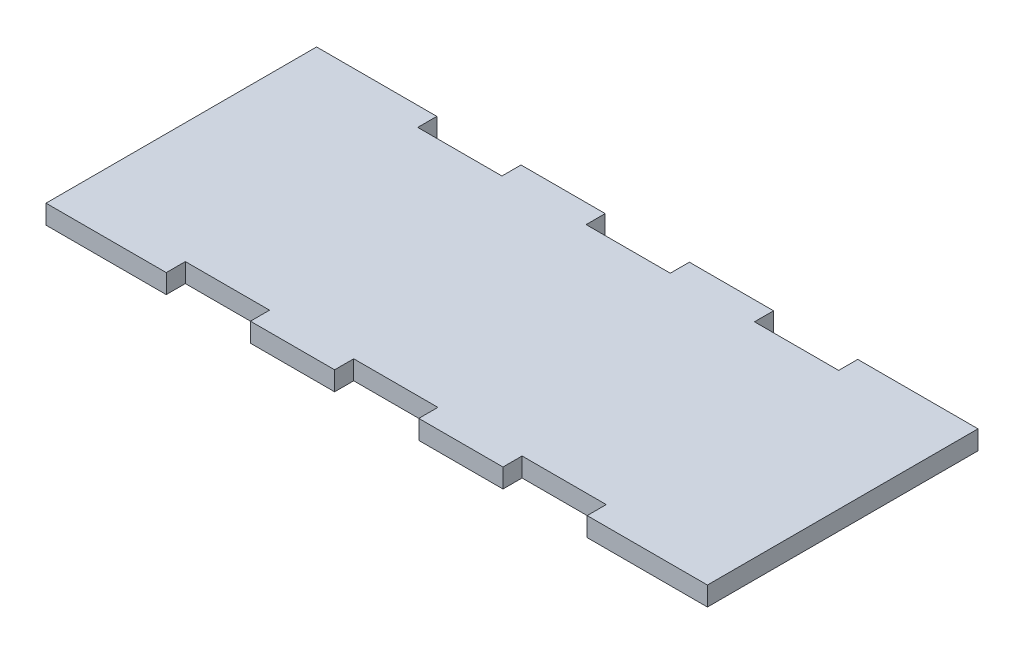
ISO-10303-21;
HEADER;
FILE_DESCRIPTION(('STEP AP214'),'2;1');
FILE_NAME('part.step','',(''),(''),'','','');
FILE_SCHEMA(('AUTOMOTIVE_DESIGN { 1 0 10303 214 1 1 1 1 }'));
ENDSEC;
DATA;
#1=APPLICATION_CONTEXT('core data for automotive mechanical design processes');
#2=APPLICATION_PROTOCOL_DEFINITION('international standard','automotive_design',2000,#1);
#3=PRODUCT_CONTEXT('',#1,'mechanical');
#4=PRODUCT('Part','Part','',(#3));
#5=PRODUCT_RELATED_PRODUCT_CATEGORY('part','',(#4));
#6=PRODUCT_DEFINITION_FORMATION('','',#4);
#7=PRODUCT_DEFINITION_CONTEXT('part definition',#1,'design');
#8=PRODUCT_DEFINITION('design','',#6,#7);
#9=PRODUCT_DEFINITION_SHAPE('','',#8);
#10=(LENGTH_UNIT() NAMED_UNIT(*) SI_UNIT(.MILLI.,.METRE.));
#11=(NAMED_UNIT(*) PLANE_ANGLE_UNIT() SI_UNIT($,.RADIAN.));
#12=(NAMED_UNIT(*) SI_UNIT($,.STERADIAN.) SOLID_ANGLE_UNIT());
#13=UNCERTAINTY_MEASURE_WITH_UNIT(LENGTH_MEASURE(1.E-05),#10,'distance_accuracy_value','');
#14=(GEOMETRIC_REPRESENTATION_CONTEXT(3) GLOBAL_UNCERTAINTY_ASSIGNED_CONTEXT((#13)) GLOBAL_UNIT_ASSIGNED_CONTEXT((#10,
#11,#12)) REPRESENTATION_CONTEXT('',''));
#15=CARTESIAN_POINT('',(0.,0.,0.));
#16=DIRECTION('',(0.,0.,1.));
#17=DIRECTION('',(1.,0.,0.));
#18=AXIS2_PLACEMENT_3D('',#15,#16,#17);
#19=CARTESIAN_POINT('',(62.,3.175,0.));
#20=DIRECTION('',(1.,0.,0.));
#21=DIRECTION('',(0.,0.,-1.));
#22=AXIS2_PLACEMENT_3D('',#19,#20,#21);
#23=PLANE('',#22);
#24=DIRECTION('',(0.,0.,1.));
#25=VECTOR('',#24,1.);
#26=CARTESIAN_POINT('',(62.,0.,0.));
#27=LINE('',#26,#25);
#28=CARTESIAN_POINT('',(62.,0.,-3.175));
#29=VERTEX_POINT('',#28);
#30=CARTESIAN_POINT('',(62.,0.,0.));
#31=VERTEX_POINT('',#30);
#32=EDGE_CURVE('E251',#29,#31,#27,.T.);
#33=ORIENTED_EDGE('',*,*,#32,.T.);
#34=DIRECTION('',(0.,-1.,0.));
#35=VECTOR('',#34,1.);
#36=CARTESIAN_POINT('',(62.,3.175,0.));
#37=LINE('',#36,#35);
#38=CARTESIAN_POINT('',(62.,3.175,0.));
#39=VERTEX_POINT('',#38);
#40=EDGE_CURVE('E11',#39,#31,#37,.T.);
#41=ORIENTED_EDGE('',*,*,#40,.F.);
#42=DIRECTION('',(0.,0.,1.));
#43=VECTOR('',#42,1.);
#44=CARTESIAN_POINT('',(62.,3.175,0.));
#45=LINE('',#44,#43);
#46=CARTESIAN_POINT('',(62.,3.175,-3.175));
#47=VERTEX_POINT('',#46);
#48=EDGE_CURVE('E320',#47,#39,#45,.T.);
#49=ORIENTED_EDGE('',*,*,#48,.F.);
#50=DIRECTION('',(0.,-1.,0.));
#51=VECTOR('',#50,1.);
#52=CARTESIAN_POINT('',(62.,3.175,-3.175));
#53=LINE('',#52,#51);
#54=EDGE_CURVE('E247',#47,#29,#53,.T.);
#55=ORIENTED_EDGE('',*,*,#54,.T.);
#56=EDGE_LOOP('',(#33,#41,#49,#55));
#57=FACE_BOUND('',#56,.T.);
#58=ADVANCED_FACE('F35',(#57),#23,.F.);
#59=CARTESIAN_POINT('',(0.,3.175,0.));
#60=DIRECTION('',(0.,0.,-1.));
#61=DIRECTION('',(-1.,0.,0.));
#62=AXIS2_PLACEMENT_3D('',#59,#60,#61);
#63=PLANE('',#62);
#64=DIRECTION('',(1.,0.,0.));
#65=VECTOR('',#64,1.);
#66=CARTESIAN_POINT('',(0.,0.,0.));
#67=LINE('',#66,#65);
#68=CARTESIAN_POINT('',(76.,0.,0.));
#69=VERTEX_POINT('',#68);
#70=EDGE_CURVE('E254',#31,#69,#67,.T.);
#71=ORIENTED_EDGE('',*,*,#70,.T.);
#72=DIRECTION('',(0.,-1.,0.));
#73=VECTOR('',#72,1.);
#74=CARTESIAN_POINT('',(76.,3.175,0.));
#75=LINE('',#74,#73);
#76=CARTESIAN_POINT('',(76.,3.175,0.));
#77=VERTEX_POINT('',#76);
#78=EDGE_CURVE('E43',#77,#69,#75,.T.);
#79=ORIENTED_EDGE('',*,*,#78,.F.);
#80=DIRECTION('',(1.,0.,0.));
#81=VECTOR('',#80,1.);
#82=CARTESIAN_POINT('',(0.,3.175,0.));
#83=LINE('',#82,#81);
#84=EDGE_CURVE('E154',#39,#77,#83,.T.);
#85=ORIENTED_EDGE('',*,*,#84,.F.);
#86=ORIENTED_EDGE('',*,*,#40,.T.);
#87=EDGE_LOOP('',(#71,#79,#85,#86));
#88=FACE_BOUND('',#87,.T.);
#89=ADVANCED_FACE('F477',(#88),#63,.F.);
#90=CARTESIAN_POINT('',(76.,3.175,0.));
#91=DIRECTION('',(-1.,0.,0.));
#92=DIRECTION('',(0.,0.,1.));
#93=AXIS2_PLACEMENT_3D('',#90,#91,#92);
#94=PLANE('',#93);
#95=DIRECTION('',(0.,0.,-1.));
#96=VECTOR('',#95,1.);
#97=CARTESIAN_POINT('',(76.,0.,0.));
#98=LINE('',#97,#96);
#99=CARTESIAN_POINT('',(76.,0.,-3.175));
#100=VERTEX_POINT('',#99);
#101=EDGE_CURVE('E256',#69,#100,#98,.T.);
#102=ORIENTED_EDGE('',*,*,#101,.T.);
#103=DIRECTION('',(0.,-1.,0.));
#104=VECTOR('',#103,1.);
#105=CARTESIAN_POINT('',(76.,3.175,-3.175));
#106=LINE('',#105,#104);
#107=CARTESIAN_POINT('',(76.,3.175,-3.175));
#108=VERTEX_POINT('',#107);
#109=EDGE_CURVE('E372',#108,#100,#106,.T.);
#110=ORIENTED_EDGE('',*,*,#109,.F.);
#111=DIRECTION('',(0.,0.,-1.));
#112=VECTOR('',#111,1.);
#113=CARTESIAN_POINT('',(76.,3.175,0.));
#114=LINE('',#113,#112);
#115=EDGE_CURVE('E380',#77,#108,#114,.T.);
#116=ORIENTED_EDGE('',*,*,#115,.F.);
#117=ORIENTED_EDGE('',*,*,#78,.T.);
#118=EDGE_LOOP('',(#102,#110,#116,#117));
#119=FACE_BOUND('',#118,.T.);
#120=ADVANCED_FACE('F378',(#119),#94,.F.);
#121=CARTESIAN_POINT('',(0.,3.175,-3.175));
#122=DIRECTION('',(0.,0.,-1.));
#123=DIRECTION('',(-1.,0.,0.));
#124=AXIS2_PLACEMENT_3D('',#121,#122,#123);
#125=PLANE('',#124);
#126=DIRECTION('',(1.,0.,0.));
#127=VECTOR('',#126,1.);
#128=CARTESIAN_POINT('',(0.,0.,-3.175));
#129=LINE('',#128,#127);
#130=CARTESIAN_POINT('',(90.,0.,-3.175));
#131=VERTEX_POINT('',#130);
#132=EDGE_CURVE('E258',#100,#131,#129,.T.);
#133=ORIENTED_EDGE('',*,*,#132,.T.);
#134=DIRECTION('',(0.,-1.,0.));
#135=VECTOR('',#134,1.);
#136=CARTESIAN_POINT('',(90.,3.175,-3.175));
#137=LINE('',#136,#135);
#138=CARTESIAN_POINT('',(90.,3.175,-3.175));
#139=VERTEX_POINT('',#138);
#140=EDGE_CURVE('E369',#139,#131,#137,.T.);
#141=ORIENTED_EDGE('',*,*,#140,.F.);
#142=DIRECTION('',(1.,0.,0.));
#143=VECTOR('',#142,1.);
#144=CARTESIAN_POINT('',(0.,3.175,-3.175));
#145=LINE('',#144,#143);
#146=EDGE_CURVE('E398',#108,#139,#145,.T.);
#147=ORIENTED_EDGE('',*,*,#146,.F.);
#148=ORIENTED_EDGE('',*,*,#109,.T.);
#149=EDGE_LOOP('',(#133,#141,#147,#148));
#150=FACE_BOUND('',#149,.T.);
#151=ADVANCED_FACE('F389',(#150),#125,.F.);
#152=CARTESIAN_POINT('',(90.,3.175,0.));
#153=DIRECTION('',(1.,0.,0.));
#154=DIRECTION('',(0.,0.,-1.));
#155=AXIS2_PLACEMENT_3D('',#152,#153,#154);
#156=PLANE('',#155);
#157=DIRECTION('',(0.,0.,1.));
#158=VECTOR('',#157,1.);
#159=CARTESIAN_POINT('',(90.,0.,0.));
#160=LINE('',#159,#158);
#161=CARTESIAN_POINT('',(90.,0.,0.));
#162=VERTEX_POINT('',#161);
#163=EDGE_CURVE('E260',#131,#162,#160,.T.);
#164=ORIENTED_EDGE('',*,*,#163,.T.);
#165=DIRECTION('',(0.,-1.,0.));
#166=VECTOR('',#165,1.);
#167=CARTESIAN_POINT('',(90.,3.175,0.));
#168=LINE('',#167,#166);
#169=CARTESIAN_POINT('',(90.,3.175,0.));
#170=VERTEX_POINT('',#169);
#171=EDGE_CURVE('E366',#170,#162,#168,.T.);
#172=ORIENTED_EDGE('',*,*,#171,.F.);
#173=DIRECTION('',(0.,0.,1.));
#174=VECTOR('',#173,1.);
#175=CARTESIAN_POINT('',(90.,3.175,0.));
#176=LINE('',#175,#174);
#177=EDGE_CURVE('E395',#139,#170,#176,.T.);
#178=ORIENTED_EDGE('',*,*,#177,.F.);
#179=ORIENTED_EDGE('',*,*,#140,.T.);
#180=EDGE_LOOP('',(#164,#172,#178,#179));
#181=FACE_BOUND('',#180,.T.);
#182=ADVANCED_FACE('F393',(#181),#156,.F.);
#183=CARTESIAN_POINT('',(0.,3.175,0.));
#184=DIRECTION('',(0.,0.,-1.));
#185=DIRECTION('',(-1.,0.,0.));
#186=AXIS2_PLACEMENT_3D('',#183,#184,#185);
#187=PLANE('',#186);
#188=DIRECTION('',(1.,0.,0.));
#189=VECTOR('',#188,1.);
#190=CARTESIAN_POINT('',(0.,0.,0.));
#191=LINE('',#190,#189);
#192=CARTESIAN_POINT('',(110.,0.,0.));
#193=VERTEX_POINT('',#192);
#194=EDGE_CURVE('E262',#162,#193,#191,.T.);
#195=ORIENTED_EDGE('',*,*,#194,.T.);
#196=DIRECTION('',(0.,-1.,0.));
#197=VECTOR('',#196,1.);
#198=CARTESIAN_POINT('',(110.,3.175,0.));
#199=LINE('',#198,#197);
#200=CARTESIAN_POINT('',(110.,3.175,0.));
#201=VERTEX_POINT('',#200);
#202=EDGE_CURVE('E363',#201,#193,#199,.T.);
#203=ORIENTED_EDGE('',*,*,#202,.F.);
#204=DIRECTION('',(1.,0.,0.));
#205=VECTOR('',#204,1.);
#206=CARTESIAN_POINT('',(0.,3.175,0.));
#207=LINE('',#206,#205);
#208=EDGE_CURVE('E397',#170,#201,#207,.T.);
#209=ORIENTED_EDGE('',*,*,#208,.F.);
#210=ORIENTED_EDGE('',*,*,#171,.T.);
#211=EDGE_LOOP('',(#195,#203,#209,#210));
#212=FACE_BOUND('',#211,.T.);
#213=ADVANCED_FACE('F490',(#212),#187,.F.);
#214=CARTESIAN_POINT('',(110.,3.175,0.));
#215=DIRECTION('',(-1.,0.,0.));
#216=DIRECTION('',(0.,0.,1.));
#217=AXIS2_PLACEMENT_3D('',#214,#215,#216);
#218=PLANE('',#217);
#219=DIRECTION('',(0.,0.,-1.));
#220=VECTOR('',#219,1.);
#221=CARTESIAN_POINT('',(110.,0.,0.));
#222=LINE('',#221,#220);
#223=CARTESIAN_POINT('',(110.,0.,-45.));
#224=VERTEX_POINT('',#223);
#225=EDGE_CURVE('E264',#193,#224,#222,.T.);
#226=ORIENTED_EDGE('',*,*,#225,.T.);
#227=DIRECTION('',(0.,-1.,0.));
#228=VECTOR('',#227,1.);
#229=CARTESIAN_POINT('',(110.,3.175,-45.));
#230=LINE('',#229,#228);
#231=CARTESIAN_POINT('',(110.,3.175,-45.));
#232=VERTEX_POINT('',#231);
#233=EDGE_CURVE('E361',#232,#224,#230,.T.);
#234=ORIENTED_EDGE('',*,*,#233,.F.);
#235=DIRECTION('',(0.,0.,-1.));
#236=VECTOR('',#235,1.);
#237=CARTESIAN_POINT('',(110.,3.175,0.));
#238=LINE('',#237,#236);
#239=EDGE_CURVE('E400',#201,#232,#238,.T.);
#240=ORIENTED_EDGE('',*,*,#239,.F.);
#241=ORIENTED_EDGE('',*,*,#202,.T.);
#242=EDGE_LOOP('',(#226,#234,#240,#241));
#243=FACE_BOUND('',#242,.T.);
#244=ADVANCED_FACE('F493',(#243),#218,.F.);
#245=CARTESIAN_POINT('',(0.,3.175,-45.));
#246=DIRECTION('',(0.,0.,-1.));
#247=DIRECTION('',(-1.,0.,0.));
#248=AXIS2_PLACEMENT_3D('',#245,#246,#247);
#249=PLANE('',#248);
#250=DIRECTION('',(1.,0.,0.));
#251=VECTOR('',#250,1.);
#252=CARTESIAN_POINT('',(0.,0.,-45.));
#253=LINE('',#252,#251);
#254=CARTESIAN_POINT('',(90.,0.,-45.));
#255=VERTEX_POINT('',#254);
#256=EDGE_CURVE('E267',#255,#224,#253,.T.);
#257=ORIENTED_EDGE('',*,*,#256,.F.);
#258=DIRECTION('',(0.,-1.,0.));
#259=VECTOR('',#258,1.);
#260=CARTESIAN_POINT('',(90.,3.175,-45.));
#261=LINE('',#260,#259);
#262=CARTESIAN_POINT('',(90.,3.175,-45.));
#263=VERTEX_POINT('',#262);
#264=EDGE_CURVE('E359',#263,#255,#261,.T.);
#265=ORIENTED_EDGE('',*,*,#264,.F.);
#266=DIRECTION('',(1.,0.,0.));
#267=VECTOR('',#266,1.);
#268=CARTESIAN_POINT('',(0.,3.175,-45.));
#269=LINE('',#268,#267);
#270=EDGE_CURVE('E406',#263,#232,#269,.T.);
#271=ORIENTED_EDGE('',*,*,#270,.T.);
#272=ORIENTED_EDGE('',*,*,#233,.T.);
#273=EDGE_LOOP('',(#257,#265,#271,#272));
#274=FACE_BOUND('',#273,.T.);
#275=ADVANCED_FACE('F497',(#274),#249,.T.);
#276=CARTESIAN_POINT('',(90.,3.175,0.));
#277=DIRECTION('',(-1.,0.,0.));
#278=DIRECTION('',(0.,0.,1.));
#279=AXIS2_PLACEMENT_3D('',#276,#277,#278);
#280=PLANE('',#279);
#281=DIRECTION('',(0.,0.,-1.));
#282=VECTOR('',#281,1.);
#283=CARTESIAN_POINT('',(90.,0.,0.));
#284=LINE('',#283,#282);
#285=CARTESIAN_POINT('',(90.,0.,-41.825));
#286=VERTEX_POINT('',#285);
#287=EDGE_CURVE('E270',#286,#255,#284,.T.);
#288=ORIENTED_EDGE('',*,*,#287,.F.);
#289=DIRECTION('',(0.,-1.,0.));
#290=VECTOR('',#289,1.);
#291=CARTESIAN_POINT('',(90.,3.175,-41.825));
#292=LINE('',#291,#290);
#293=CARTESIAN_POINT('',(90.,3.175,-41.825));
#294=VERTEX_POINT('',#293);
#295=EDGE_CURVE('E357',#294,#286,#292,.T.);
#296=ORIENTED_EDGE('',*,*,#295,.F.);
#297=DIRECTION('',(0.,0.,-1.));
#298=VECTOR('',#297,1.);
#299=CARTESIAN_POINT('',(90.,3.175,0.));
#300=LINE('',#299,#298);
#301=EDGE_CURVE('E409',#294,#263,#300,.T.);
#302=ORIENTED_EDGE('',*,*,#301,.T.);
#303=ORIENTED_EDGE('',*,*,#264,.T.);
#304=EDGE_LOOP('',(#288,#296,#302,#303));
#305=FACE_BOUND('',#304,.T.);
#306=ADVANCED_FACE('F501',(#305),#280,.T.);
#307=CARTESIAN_POINT('',(0.,3.175,-41.825));
#308=DIRECTION('',(0.,0.,-1.));
#309=DIRECTION('',(-1.,0.,0.));
#310=AXIS2_PLACEMENT_3D('',#307,#308,#309);
#311=PLANE('',#310);
#312=DIRECTION('',(1.,0.,0.));
#313=VECTOR('',#312,1.);
#314=CARTESIAN_POINT('',(0.,0.,-41.825));
#315=LINE('',#314,#313);
#316=CARTESIAN_POINT('',(76.,0.,-41.825));
#317=VERTEX_POINT('',#316);
#318=EDGE_CURVE('E273',#317,#286,#315,.T.);
#319=ORIENTED_EDGE('',*,*,#318,.F.);
#320=DIRECTION('',(0.,-1.,0.));
#321=VECTOR('',#320,1.);
#322=CARTESIAN_POINT('',(76.,3.175,-41.825));
#323=LINE('',#322,#321);
#324=CARTESIAN_POINT('',(76.,3.175,-41.825));
#325=VERTEX_POINT('',#324);
#326=EDGE_CURVE('E355',#325,#317,#323,.T.);
#327=ORIENTED_EDGE('',*,*,#326,.F.);
#328=DIRECTION('',(1.,0.,0.));
#329=VECTOR('',#328,1.);
#330=CARTESIAN_POINT('',(0.,3.175,-41.825));
#331=LINE('',#330,#329);
#332=EDGE_CURVE('E412',#325,#294,#331,.T.);
#333=ORIENTED_EDGE('',*,*,#332,.T.);
#334=ORIENTED_EDGE('',*,*,#295,.T.);
#335=EDGE_LOOP('',(#319,#327,#333,#334));
#336=FACE_BOUND('',#335,.T.);
#337=ADVANCED_FACE('F505',(#336),#311,.T.);
#338=CARTESIAN_POINT('',(76.,3.175,0.));
#339=DIRECTION('',(1.,0.,0.));
#340=DIRECTION('',(0.,0.,-1.));
#341=AXIS2_PLACEMENT_3D('',#338,#339,#340);
#342=PLANE('',#341);
#343=DIRECTION('',(0.,0.,1.));
#344=VECTOR('',#343,1.);
#345=CARTESIAN_POINT('',(76.,0.,0.));
#346=LINE('',#345,#344);
#347=CARTESIAN_POINT('',(76.,0.,-45.));
#348=VERTEX_POINT('',#347);
#349=EDGE_CURVE('E276',#348,#317,#346,.T.);
#350=ORIENTED_EDGE('',*,*,#349,.F.);
#351=DIRECTION('',(0.,-1.,0.));
#352=VECTOR('',#351,1.);
#353=CARTESIAN_POINT('',(76.,3.175,-45.));
#354=LINE('',#353,#352);
#355=CARTESIAN_POINT('',(76.,3.175,-45.));
#356=VERTEX_POINT('',#355);
#357=EDGE_CURVE('E353',#356,#348,#354,.T.);
#358=ORIENTED_EDGE('',*,*,#357,.F.);
#359=DIRECTION('',(0.,0.,1.));
#360=VECTOR('',#359,1.);
#361=CARTESIAN_POINT('',(76.,3.175,0.));
#362=LINE('',#361,#360);
#363=EDGE_CURVE('E415',#356,#325,#362,.T.);
#364=ORIENTED_EDGE('',*,*,#363,.T.);
#365=ORIENTED_EDGE('',*,*,#326,.T.);
#366=EDGE_LOOP('',(#350,#358,#364,#365));
#367=FACE_BOUND('',#366,.T.);
#368=ADVANCED_FACE('F509',(#367),#342,.T.);
#369=CARTESIAN_POINT('',(0.,3.175,-45.));
#370=DIRECTION('',(0.,0.,-1.));
#371=DIRECTION('',(-1.,0.,0.));
#372=AXIS2_PLACEMENT_3D('',#369,#370,#371);
#373=PLANE('',#372);
#374=DIRECTION('',(1.,0.,0.));
#375=VECTOR('',#374,1.);
#376=CARTESIAN_POINT('',(0.,0.,-45.));
#377=LINE('',#376,#375);
#378=CARTESIAN_POINT('',(62.,0.,-45.));
#379=VERTEX_POINT('',#378);
#380=EDGE_CURVE('E279',#379,#348,#377,.T.);
#381=ORIENTED_EDGE('',*,*,#380,.F.);
#382=DIRECTION('',(0.,-1.,0.));
#383=VECTOR('',#382,1.);
#384=CARTESIAN_POINT('',(62.,3.175,-45.));
#385=LINE('',#384,#383);
#386=CARTESIAN_POINT('',(62.,3.175,-45.));
#387=VERTEX_POINT('',#386);
#388=EDGE_CURVE('E351',#387,#379,#385,.T.);
#389=ORIENTED_EDGE('',*,*,#388,.F.);
#390=DIRECTION('',(1.,0.,0.));
#391=VECTOR('',#390,1.);
#392=CARTESIAN_POINT('',(0.,3.175,-45.));
#393=LINE('',#392,#391);
#394=EDGE_CURVE('E418',#387,#356,#393,.T.);
#395=ORIENTED_EDGE('',*,*,#394,.T.);
#396=ORIENTED_EDGE('',*,*,#357,.T.);
#397=EDGE_LOOP('',(#381,#389,#395,#396));
#398=FACE_BOUND('',#397,.T.);
#399=ADVANCED_FACE('F513',(#398),#373,.T.);
#400=CARTESIAN_POINT('',(62.,3.175,0.));
#401=DIRECTION('',(-1.,0.,0.));
#402=DIRECTION('',(0.,0.,1.));
#403=AXIS2_PLACEMENT_3D('',#400,#401,#402);
#404=PLANE('',#403);
#405=DIRECTION('',(0.,0.,-1.));
#406=VECTOR('',#405,1.);
#407=CARTESIAN_POINT('',(62.,0.,0.));
#408=LINE('',#407,#406);
#409=CARTESIAN_POINT('',(62.,0.,-41.825));
#410=VERTEX_POINT('',#409);
#411=EDGE_CURVE('E282',#410,#379,#408,.T.);
#412=ORIENTED_EDGE('',*,*,#411,.F.);
#413=DIRECTION('',(0.,-1.,0.));
#414=VECTOR('',#413,1.);
#415=CARTESIAN_POINT('',(62.,3.175,-41.825));
#416=LINE('',#415,#414);
#417=CARTESIAN_POINT('',(62.,3.175,-41.825));
#418=VERTEX_POINT('',#417);
#419=EDGE_CURVE('E349',#418,#410,#416,.T.);
#420=ORIENTED_EDGE('',*,*,#419,.F.);
#421=DIRECTION('',(0.,0.,-1.));
#422=VECTOR('',#421,1.);
#423=CARTESIAN_POINT('',(62.,3.175,0.));
#424=LINE('',#423,#422);
#425=EDGE_CURVE('E421',#418,#387,#424,.T.);
#426=ORIENTED_EDGE('',*,*,#425,.T.);
#427=ORIENTED_EDGE('',*,*,#388,.T.);
#428=EDGE_LOOP('',(#412,#420,#426,#427));
#429=FACE_BOUND('',#428,.T.);
#430=ADVANCED_FACE('F517',(#429),#404,.T.);
#431=CARTESIAN_POINT('',(0.,3.175,-41.825));
#432=DIRECTION('',(0.,0.,-1.));
#433=DIRECTION('',(-1.,0.,0.));
#434=AXIS2_PLACEMENT_3D('',#431,#432,#433);
#435=PLANE('',#434);
#436=DIRECTION('',(1.,0.,0.));
#437=VECTOR('',#436,1.);
#438=CARTESIAN_POINT('',(0.,0.,-41.825));
#439=LINE('',#438,#437);
#440=CARTESIAN_POINT('',(48.,0.,-41.825));
#441=VERTEX_POINT('',#440);
#442=EDGE_CURVE('E285',#441,#410,#439,.T.);
#443=ORIENTED_EDGE('',*,*,#442,.F.);
#444=DIRECTION('',(0.,-1.,0.));
#445=VECTOR('',#444,1.);
#446=CARTESIAN_POINT('',(48.,3.175,-41.825));
#447=LINE('',#446,#445);
#448=CARTESIAN_POINT('',(48.,3.175,-41.825));
#449=VERTEX_POINT('',#448);
#450=EDGE_CURVE('E347',#449,#441,#447,.T.);
#451=ORIENTED_EDGE('',*,*,#450,.F.);
#452=DIRECTION('',(1.,0.,0.));
#453=VECTOR('',#452,1.);
#454=CARTESIAN_POINT('',(0.,3.175,-41.825));
#455=LINE('',#454,#453);
#456=EDGE_CURVE('E424',#449,#418,#455,.T.);
#457=ORIENTED_EDGE('',*,*,#456,.T.);
#458=ORIENTED_EDGE('',*,*,#419,.T.);
#459=EDGE_LOOP('',(#443,#451,#457,#458));
#460=FACE_BOUND('',#459,.T.);
#461=ADVANCED_FACE('F521',(#460),#435,.T.);
#462=CARTESIAN_POINT('',(48.,3.175,0.));
#463=DIRECTION('',(1.,0.,0.));
#464=DIRECTION('',(0.,0.,-1.));
#465=AXIS2_PLACEMENT_3D('',#462,#463,#464);
#466=PLANE('',#465);
#467=DIRECTION('',(0.,0.,1.));
#468=VECTOR('',#467,1.);
#469=CARTESIAN_POINT('',(48.,0.,0.));
#470=LINE('',#469,#468);
#471=CARTESIAN_POINT('',(48.,0.,-45.));
#472=VERTEX_POINT('',#471);
#473=EDGE_CURVE('E288',#472,#441,#470,.T.);
#474=ORIENTED_EDGE('',*,*,#473,.F.);
#475=DIRECTION('',(0.,-1.,0.));
#476=VECTOR('',#475,1.);
#477=CARTESIAN_POINT('',(48.,3.175,-45.));
#478=LINE('',#477,#476);
#479=CARTESIAN_POINT('',(48.,3.175,-45.));
#480=VERTEX_POINT('',#479);
#481=EDGE_CURVE('E345',#480,#472,#478,.T.);
#482=ORIENTED_EDGE('',*,*,#481,.F.);
#483=DIRECTION('',(0.,0.,1.));
#484=VECTOR('',#483,1.);
#485=CARTESIAN_POINT('',(48.,3.175,0.));
#486=LINE('',#485,#484);
#487=EDGE_CURVE('E427',#480,#449,#486,.T.);
#488=ORIENTED_EDGE('',*,*,#487,.T.);
#489=ORIENTED_EDGE('',*,*,#450,.T.);
#490=EDGE_LOOP('',(#474,#482,#488,#489));
#491=FACE_BOUND('',#490,.T.);
#492=ADVANCED_FACE('F525',(#491),#466,.T.);
#493=CARTESIAN_POINT('',(0.,3.175,-45.));
#494=DIRECTION('',(0.,0.,-1.));
#495=DIRECTION('',(-1.,0.,0.));
#496=AXIS2_PLACEMENT_3D('',#493,#494,#495);
#497=PLANE('',#496);
#498=DIRECTION('',(1.,0.,0.));
#499=VECTOR('',#498,1.);
#500=CARTESIAN_POINT('',(0.,0.,-45.));
#501=LINE('',#500,#499);
#502=CARTESIAN_POINT('',(34.,0.,-45.));
#503=VERTEX_POINT('',#502);
#504=EDGE_CURVE('E291',#503,#472,#501,.T.);
#505=ORIENTED_EDGE('',*,*,#504,.F.);
#506=DIRECTION('',(0.,-1.,0.));
#507=VECTOR('',#506,1.);
#508=CARTESIAN_POINT('',(34.,3.175,-45.));
#509=LINE('',#508,#507);
#510=CARTESIAN_POINT('',(34.,3.175,-45.));
#511=VERTEX_POINT('',#510);
#512=EDGE_CURVE('E343',#511,#503,#509,.T.);
#513=ORIENTED_EDGE('',*,*,#512,.F.);
#514=DIRECTION('',(1.,0.,0.));
#515=VECTOR('',#514,1.);
#516=CARTESIAN_POINT('',(0.,3.175,-45.));
#517=LINE('',#516,#515);
#518=EDGE_CURVE('E430',#511,#480,#517,.T.);
#519=ORIENTED_EDGE('',*,*,#518,.T.);
#520=ORIENTED_EDGE('',*,*,#481,.T.);
#521=EDGE_LOOP('',(#505,#513,#519,#520));
#522=FACE_BOUND('',#521,.T.);
#523=ADVANCED_FACE('F529',(#522),#497,.T.);
#524=CARTESIAN_POINT('',(34.,3.175,0.));
#525=DIRECTION('',(-1.,0.,0.));
#526=DIRECTION('',(0.,0.,1.));
#527=AXIS2_PLACEMENT_3D('',#524,#525,#526);
#528=PLANE('',#527);
#529=DIRECTION('',(0.,0.,-1.));
#530=VECTOR('',#529,1.);
#531=CARTESIAN_POINT('',(34.,0.,0.));
#532=LINE('',#531,#530);
#533=CARTESIAN_POINT('',(34.,0.,-41.825));
#534=VERTEX_POINT('',#533);
#535=EDGE_CURVE('E294',#534,#503,#532,.T.);
#536=ORIENTED_EDGE('',*,*,#535,.F.);
#537=DIRECTION('',(0.,-1.,0.));
#538=VECTOR('',#537,1.);
#539=CARTESIAN_POINT('',(34.,3.175,-41.825));
#540=LINE('',#539,#538);
#541=CARTESIAN_POINT('',(34.,3.175,-41.825));
#542=VERTEX_POINT('',#541);
#543=EDGE_CURVE('E341',#542,#534,#540,.T.);
#544=ORIENTED_EDGE('',*,*,#543,.F.);
#545=DIRECTION('',(0.,0.,-1.));
#546=VECTOR('',#545,1.);
#547=CARTESIAN_POINT('',(34.,3.175,0.));
#548=LINE('',#547,#546);
#549=EDGE_CURVE('E433',#542,#511,#548,.T.);
#550=ORIENTED_EDGE('',*,*,#549,.T.);
#551=ORIENTED_EDGE('',*,*,#512,.T.);
#552=EDGE_LOOP('',(#536,#544,#550,#551));
#553=FACE_BOUND('',#552,.T.);
#554=ADVANCED_FACE('F533',(#553),#528,.T.);
#555=CARTESIAN_POINT('',(0.,3.175,-41.825));
#556=DIRECTION('',(0.,0.,-1.));
#557=DIRECTION('',(-1.,0.,0.));
#558=AXIS2_PLACEMENT_3D('',#555,#556,#557);
#559=PLANE('',#558);
#560=DIRECTION('',(1.,0.,0.));
#561=VECTOR('',#560,1.);
#562=CARTESIAN_POINT('',(0.,0.,-41.825));
#563=LINE('',#562,#561);
#564=CARTESIAN_POINT('',(20.,0.,-41.825));
#565=VERTEX_POINT('',#564);
#566=EDGE_CURVE('E297',#565,#534,#563,.T.);
#567=ORIENTED_EDGE('',*,*,#566,.F.);
#568=DIRECTION('',(0.,-1.,0.));
#569=VECTOR('',#568,1.);
#570=CARTESIAN_POINT('',(20.,3.175,-41.825));
#571=LINE('',#570,#569);
#572=CARTESIAN_POINT('',(20.,3.175,-41.825));
#573=VERTEX_POINT('',#572);
#574=EDGE_CURVE('E339',#573,#565,#571,.T.);
#575=ORIENTED_EDGE('',*,*,#574,.F.);
#576=DIRECTION('',(1.,0.,0.));
#577=VECTOR('',#576,1.);
#578=CARTESIAN_POINT('',(0.,3.175,-41.825));
#579=LINE('',#578,#577);
#580=EDGE_CURVE('E436',#573,#542,#579,.T.);
#581=ORIENTED_EDGE('',*,*,#580,.T.);
#582=ORIENTED_EDGE('',*,*,#543,.T.);
#583=EDGE_LOOP('',(#567,#575,#581,#582));
#584=FACE_BOUND('',#583,.T.);
#585=ADVANCED_FACE('F537',(#584),#559,.T.);
#586=CARTESIAN_POINT('',(20.,3.175,0.));
#587=DIRECTION('',(1.,0.,0.));
#588=DIRECTION('',(0.,0.,-1.));
#589=AXIS2_PLACEMENT_3D('',#586,#587,#588);
#590=PLANE('',#589);
#591=DIRECTION('',(0.,0.,1.));
#592=VECTOR('',#591,1.);
#593=CARTESIAN_POINT('',(20.,0.,0.));
#594=LINE('',#593,#592);
#595=CARTESIAN_POINT('',(20.,0.,-45.));
#596=VERTEX_POINT('',#595);
#597=EDGE_CURVE('E300',#596,#565,#594,.T.);
#598=ORIENTED_EDGE('',*,*,#597,.F.);
#599=DIRECTION('',(0.,-1.,0.));
#600=VECTOR('',#599,1.);
#601=CARTESIAN_POINT('',(20.,3.175,-45.));
#602=LINE('',#601,#600);
#603=CARTESIAN_POINT('',(20.,3.175,-45.));
#604=VERTEX_POINT('',#603);
#605=EDGE_CURVE('E337',#604,#596,#602,.T.);
#606=ORIENTED_EDGE('',*,*,#605,.F.);
#607=DIRECTION('',(0.,0.,1.));
#608=VECTOR('',#607,1.);
#609=CARTESIAN_POINT('',(20.,3.175,0.));
#610=LINE('',#609,#608);
#611=EDGE_CURVE('E439',#604,#573,#610,.T.);
#612=ORIENTED_EDGE('',*,*,#611,.T.);
#613=ORIENTED_EDGE('',*,*,#574,.T.);
#614=EDGE_LOOP('',(#598,#606,#612,#613));
#615=FACE_BOUND('',#614,.T.);
#616=ADVANCED_FACE('F541',(#615),#590,.T.);
#617=CARTESIAN_POINT('',(0.,3.175,-45.));
#618=DIRECTION('',(0.,0.,-1.));
#619=DIRECTION('',(-1.,0.,0.));
#620=AXIS2_PLACEMENT_3D('',#617,#618,#619);
#621=PLANE('',#620);
#622=DIRECTION('',(1.,0.,0.));
#623=VECTOR('',#622,1.);
#624=CARTESIAN_POINT('',(0.,0.,-45.));
#625=LINE('',#624,#623);
#626=CARTESIAN_POINT('',(0.,0.,-45.));
#627=VERTEX_POINT('',#626);
#628=EDGE_CURVE('E303',#627,#596,#625,.T.);
#629=ORIENTED_EDGE('',*,*,#628,.F.);
#630=DIRECTION('',(0.,-1.,0.));
#631=VECTOR('',#630,1.);
#632=CARTESIAN_POINT('',(0.,3.175,-45.));
#633=LINE('',#632,#631);
#634=CARTESIAN_POINT('',(0.,3.175,-45.));
#635=VERTEX_POINT('',#634);
#636=EDGE_CURVE('E335',#635,#627,#633,.T.);
#637=ORIENTED_EDGE('',*,*,#636,.F.);
#638=DIRECTION('',(1.,0.,0.));
#639=VECTOR('',#638,1.);
#640=CARTESIAN_POINT('',(0.,3.175,-45.));
#641=LINE('',#640,#639);
#642=EDGE_CURVE('E442',#635,#604,#641,.T.);
#643=ORIENTED_EDGE('',*,*,#642,.T.);
#644=ORIENTED_EDGE('',*,*,#605,.T.);
#645=EDGE_LOOP('',(#629,#637,#643,#644));
#646=FACE_BOUND('',#645,.T.);
#647=ADVANCED_FACE('F545',(#646),#621,.T.);
#648=CARTESIAN_POINT('',(0.,3.175,0.));
#649=DIRECTION('',(-1.,0.,0.));
#650=DIRECTION('',(0.,0.,1.));
#651=AXIS2_PLACEMENT_3D('',#648,#649,#650);
#652=PLANE('',#651);
#653=DIRECTION('',(0.,0.,-1.));
#654=VECTOR('',#653,1.);
#655=CARTESIAN_POINT('',(0.,0.,0.));
#656=LINE('',#655,#654);
#657=CARTESIAN_POINT('',(0.,0.,0.));
#658=VERTEX_POINT('',#657);
#659=EDGE_CURVE('E306',#658,#627,#656,.T.);
#660=ORIENTED_EDGE('',*,*,#659,.F.);
#661=DIRECTION('',(0.,-1.,0.));
#662=VECTOR('',#661,1.);
#663=CARTESIAN_POINT('',(0.,3.175,0.));
#664=LINE('',#663,#662);
#665=CARTESIAN_POINT('',(0.,3.175,0.));
#666=VERTEX_POINT('',#665);
#667=EDGE_CURVE('E333',#666,#658,#664,.T.);
#668=ORIENTED_EDGE('',*,*,#667,.F.);
#669=DIRECTION('',(0.,0.,-1.));
#670=VECTOR('',#669,1.);
#671=CARTESIAN_POINT('',(0.,3.175,0.));
#672=LINE('',#671,#670);
#673=EDGE_CURVE('E445',#666,#635,#672,.T.);
#674=ORIENTED_EDGE('',*,*,#673,.T.);
#675=ORIENTED_EDGE('',*,*,#636,.T.);
#676=EDGE_LOOP('',(#660,#668,#674,#675));
#677=FACE_BOUND('',#676,.T.);
#678=ADVANCED_FACE('F549',(#677),#652,.T.);
#679=CARTESIAN_POINT('',(0.,3.175,0.));
#680=DIRECTION('',(0.,0.,-1.));
#681=DIRECTION('',(-1.,0.,0.));
#682=AXIS2_PLACEMENT_3D('',#679,#680,#681);
#683=PLANE('',#682);
#684=DIRECTION('',(1.,0.,0.));
#685=VECTOR('',#684,1.);
#686=CARTESIAN_POINT('',(0.,0.,0.));
#687=LINE('',#686,#685);
#688=CARTESIAN_POINT('',(20.,0.,0.));
#689=VERTEX_POINT('',#688);
#690=EDGE_CURVE('E309',#658,#689,#687,.T.);
#691=ORIENTED_EDGE('',*,*,#690,.T.);
#692=DIRECTION('',(0.,-1.,0.));
#693=VECTOR('',#692,1.);
#694=CARTESIAN_POINT('',(20.,3.175,0.));
#695=LINE('',#694,#693);
#696=CARTESIAN_POINT('',(20.,3.175,0.));
#697=VERTEX_POINT('',#696);
#698=EDGE_CURVE('E330',#697,#689,#695,.T.);
#699=ORIENTED_EDGE('',*,*,#698,.F.);
#700=DIRECTION('',(1.,0.,0.));
#701=VECTOR('',#700,1.);
#702=CARTESIAN_POINT('',(0.,3.175,0.));
#703=LINE('',#702,#701);
#704=EDGE_CURVE('E448',#666,#697,#703,.T.);
#705=ORIENTED_EDGE('',*,*,#704,.F.);
#706=ORIENTED_EDGE('',*,*,#667,.T.);
#707=EDGE_LOOP('',(#691,#699,#705,#706));
#708=FACE_BOUND('',#707,.T.);
#709=ADVANCED_FACE('F553',(#708),#683,.F.);
#710=CARTESIAN_POINT('',(20.,3.175,0.));
#711=DIRECTION('',(-1.,0.,0.));
#712=DIRECTION('',(0.,0.,1.));
#713=AXIS2_PLACEMENT_3D('',#710,#711,#712);
#714=PLANE('',#713);
#715=DIRECTION('',(0.,0.,-1.));
#716=VECTOR('',#715,1.);
#717=CARTESIAN_POINT('',(20.,0.,0.));
#718=LINE('',#717,#716);
#719=CARTESIAN_POINT('',(20.,0.,-3.175));
#720=VERTEX_POINT('',#719);
#721=EDGE_CURVE('E311',#689,#720,#718,.T.);
#722=ORIENTED_EDGE('',*,*,#721,.T.);
#723=DIRECTION('',(0.,-1.,0.));
#724=VECTOR('',#723,1.);
#725=CARTESIAN_POINT('',(20.,3.175,-3.175));
#726=LINE('',#725,#724);
#727=CARTESIAN_POINT('',(20.,3.175,-3.175));
#728=VERTEX_POINT('',#727);
#729=EDGE_CURVE('E327',#728,#720,#726,.T.);
#730=ORIENTED_EDGE('',*,*,#729,.F.);
#731=DIRECTION('',(0.,0.,-1.));
#732=VECTOR('',#731,1.);
#733=CARTESIAN_POINT('',(20.,3.175,0.));
#734=LINE('',#733,#732);
#735=EDGE_CURVE('E450',#697,#728,#734,.T.);
#736=ORIENTED_EDGE('',*,*,#735,.F.);
#737=ORIENTED_EDGE('',*,*,#698,.T.);
#738=EDGE_LOOP('',(#722,#730,#736,#737));
#739=FACE_BOUND('',#738,.T.);
#740=ADVANCED_FACE('F557',(#739),#714,.F.);
#741=CARTESIAN_POINT('',(0.,3.175,-3.175));
#742=DIRECTION('',(0.,0.,-1.));
#743=DIRECTION('',(-1.,0.,0.));
#744=AXIS2_PLACEMENT_3D('',#741,#742,#743);
#745=PLANE('',#744);
#746=DIRECTION('',(1.,0.,0.));
#747=VECTOR('',#746,1.);
#748=CARTESIAN_POINT('',(0.,0.,-3.175));
#749=LINE('',#748,#747);
#750=CARTESIAN_POINT('',(34.,0.,-3.175));
#751=VERTEX_POINT('',#750);
#752=EDGE_CURVE('E313',#720,#751,#749,.T.);
#753=ORIENTED_EDGE('',*,*,#752,.T.);
#754=DIRECTION('',(0.,-1.,0.));
#755=VECTOR('',#754,1.);
#756=CARTESIAN_POINT('',(34.,3.175,-3.175));
#757=LINE('',#756,#755);
#758=CARTESIAN_POINT('',(34.,3.175,-3.175));
#759=VERTEX_POINT('',#758);
#760=EDGE_CURVE('E324',#759,#751,#757,.T.);
#761=ORIENTED_EDGE('',*,*,#760,.F.);
#762=DIRECTION('',(1.,0.,0.));
#763=VECTOR('',#762,1.);
#764=CARTESIAN_POINT('',(0.,3.175,-3.175));
#765=LINE('',#764,#763);
#766=EDGE_CURVE('E452',#728,#759,#765,.T.);
#767=ORIENTED_EDGE('',*,*,#766,.F.);
#768=ORIENTED_EDGE('',*,*,#729,.T.);
#769=EDGE_LOOP('',(#753,#761,#767,#768));
#770=FACE_BOUND('',#769,.T.);
#771=ADVANCED_FACE('F458',(#770),#745,.F.);
#772=CARTESIAN_POINT('',(34.,3.175,0.));
#773=DIRECTION('',(1.,0.,0.));
#774=DIRECTION('',(0.,0.,-1.));
#775=AXIS2_PLACEMENT_3D('',#772,#773,#774);
#776=PLANE('',#775);
#777=DIRECTION('',(0.,0.,1.));
#778=VECTOR('',#777,1.);
#779=CARTESIAN_POINT('',(34.,0.,0.));
#780=LINE('',#779,#778);
#781=CARTESIAN_POINT('',(34.,0.,0.));
#782=VERTEX_POINT('',#781);
#783=EDGE_CURVE('E315',#751,#782,#780,.T.);
#784=ORIENTED_EDGE('',*,*,#783,.T.);
#785=DIRECTION('',(0.,-1.,0.));
#786=VECTOR('',#785,1.);
#787=CARTESIAN_POINT('',(34.,3.175,0.));
#788=LINE('',#787,#786);
#789=CARTESIAN_POINT('',(34.,3.175,0.));
#790=VERTEX_POINT('',#789);
#791=EDGE_CURVE('E242',#790,#782,#788,.T.);
#792=ORIENTED_EDGE('',*,*,#791,.F.);
#793=DIRECTION('',(0.,0.,1.));
#794=VECTOR('',#793,1.);
#795=CARTESIAN_POINT('',(34.,3.175,0.));
#796=LINE('',#795,#794);
#797=EDGE_CURVE('E233',#759,#790,#796,.T.);
#798=ORIENTED_EDGE('',*,*,#797,.F.);
#799=ORIENTED_EDGE('',*,*,#760,.T.);
#800=EDGE_LOOP('',(#784,#792,#798,#799));
#801=FACE_BOUND('',#800,.T.);
#802=ADVANCED_FACE('F462',(#801),#776,.F.);
#803=CARTESIAN_POINT('',(0.,3.175,0.));
#804=DIRECTION('',(0.,0.,-1.));
#805=DIRECTION('',(-1.,0.,0.));
#806=AXIS2_PLACEMENT_3D('',#803,#804,#805);
#807=PLANE('',#806);
#808=DIRECTION('',(1.,0.,0.));
#809=VECTOR('',#808,1.);
#810=CARTESIAN_POINT('',(0.,0.,0.));
#811=LINE('',#810,#809);
#812=CARTESIAN_POINT('',(48.,0.,0.));
#813=VERTEX_POINT('',#812);
#814=EDGE_CURVE('E241',#782,#813,#811,.T.);
#815=ORIENTED_EDGE('',*,*,#814,.T.);
#816=DIRECTION('',(0.,-1.,0.));
#817=VECTOR('',#816,1.);
#818=CARTESIAN_POINT('',(48.,3.175,0.));
#819=LINE('',#818,#817);
#820=CARTESIAN_POINT('',(48.,3.175,0.));
#821=VERTEX_POINT('',#820);
#822=EDGE_CURVE('E238',#821,#813,#819,.T.);
#823=ORIENTED_EDGE('',*,*,#822,.F.);
#824=DIRECTION('',(1.,0.,0.));
#825=VECTOR('',#824,1.);
#826=CARTESIAN_POINT('',(0.,3.175,0.));
#827=LINE('',#826,#825);
#828=EDGE_CURVE('E227',#790,#821,#827,.T.);
#829=ORIENTED_EDGE('',*,*,#828,.F.);
#830=ORIENTED_EDGE('',*,*,#791,.T.);
#831=EDGE_LOOP('',(#815,#823,#829,#830));
#832=FACE_BOUND('',#831,.T.);
#833=ADVANCED_FACE('F239',(#832),#807,.F.);
#834=CARTESIAN_POINT('',(48.,3.175,0.));
#835=DIRECTION('',(-1.,0.,0.));
#836=DIRECTION('',(0.,0.,1.));
#837=AXIS2_PLACEMENT_3D('',#834,#835,#836);
#838=PLANE('',#837);
#839=DIRECTION('',(0.,0.,-1.));
#840=VECTOR('',#839,1.);
#841=CARTESIAN_POINT('',(48.,0.,0.));
#842=LINE('',#841,#840);
#843=CARTESIAN_POINT('',(48.,0.,-3.175));
#844=VERTEX_POINT('',#843);
#845=EDGE_CURVE('E140',#813,#844,#842,.T.);
#846=ORIENTED_EDGE('',*,*,#845,.T.);
#847=DIRECTION('',(0.,-1.,0.));
#848=VECTOR('',#847,1.);
#849=CARTESIAN_POINT('',(48.,3.175,-3.175));
#850=LINE('',#849,#848);
#851=CARTESIAN_POINT('',(48.,3.175,-3.175));
#852=VERTEX_POINT('',#851);
#853=EDGE_CURVE('E243',#852,#844,#850,.T.);
#854=ORIENTED_EDGE('',*,*,#853,.F.);
#855=DIRECTION('',(0.,0.,-1.));
#856=VECTOR('',#855,1.);
#857=CARTESIAN_POINT('',(48.,3.175,0.));
#858=LINE('',#857,#856);
#859=EDGE_CURVE('E231',#821,#852,#858,.T.);
#860=ORIENTED_EDGE('',*,*,#859,.F.);
#861=ORIENTED_EDGE('',*,*,#822,.T.);
#862=EDGE_LOOP('',(#846,#854,#860,#861));
#863=FACE_BOUND('',#862,.T.);
#864=ADVANCED_FACE('F245',(#863),#838,.F.);
#865=CARTESIAN_POINT('',(0.,3.175,-3.175));
#866=DIRECTION('',(0.,0.,-1.));
#867=DIRECTION('',(-1.,0.,0.));
#868=AXIS2_PLACEMENT_3D('',#865,#866,#867);
#869=PLANE('',#868);
#870=DIRECTION('',(1.,0.,0.));
#871=VECTOR('',#870,1.);
#872=CARTESIAN_POINT('',(0.,0.,-3.175));
#873=LINE('',#872,#871);
#874=EDGE_CURVE('E146',#844,#29,#873,.T.);
#875=ORIENTED_EDGE('',*,*,#874,.T.);
#876=ORIENTED_EDGE('',*,*,#54,.F.);
#877=DIRECTION('',(1.,0.,0.));
#878=VECTOR('',#877,1.);
#879=CARTESIAN_POINT('',(0.,3.175,-3.175));
#880=LINE('',#879,#878);
#881=EDGE_CURVE('E51',#852,#47,#880,.T.);
#882=ORIENTED_EDGE('',*,*,#881,.F.);
#883=ORIENTED_EDGE('',*,*,#853,.T.);
#884=EDGE_LOOP('',(#875,#876,#882,#883));
#885=FACE_BOUND('',#884,.T.);
#886=ADVANCED_FACE('F466',(#885),#869,.F.);
#887=CARTESIAN_POINT('',(0.,3.175,0.));
#888=DIRECTION('',(0.,1.,0.));
#889=DIRECTION('',(0.,0.,1.));
#890=AXIS2_PLACEMENT_3D('',#887,#888,#889);
#891=PLANE('',#890);
#892=ORIENTED_EDGE('',*,*,#48,.T.);
#893=ORIENTED_EDGE('',*,*,#84,.T.);
#894=ORIENTED_EDGE('',*,*,#115,.T.);
#895=ORIENTED_EDGE('',*,*,#146,.T.);
#896=ORIENTED_EDGE('',*,*,#177,.T.);
#897=ORIENTED_EDGE('',*,*,#208,.T.);
#898=ORIENTED_EDGE('',*,*,#239,.T.);
#899=ORIENTED_EDGE('',*,*,#270,.F.);
#900=ORIENTED_EDGE('',*,*,#301,.F.);
#901=ORIENTED_EDGE('',*,*,#332,.F.);
#902=ORIENTED_EDGE('',*,*,#363,.F.);
#903=ORIENTED_EDGE('',*,*,#394,.F.);
#904=ORIENTED_EDGE('',*,*,#425,.F.);
#905=ORIENTED_EDGE('',*,*,#456,.F.);
#906=ORIENTED_EDGE('',*,*,#487,.F.);
#907=ORIENTED_EDGE('',*,*,#518,.F.);
#908=ORIENTED_EDGE('',*,*,#549,.F.);
#909=ORIENTED_EDGE('',*,*,#580,.F.);
#910=ORIENTED_EDGE('',*,*,#611,.F.);
#911=ORIENTED_EDGE('',*,*,#642,.F.);
#912=ORIENTED_EDGE('',*,*,#673,.F.);
#913=ORIENTED_EDGE('',*,*,#704,.T.);
#914=ORIENTED_EDGE('',*,*,#735,.T.);
#915=ORIENTED_EDGE('',*,*,#766,.T.);
#916=ORIENTED_EDGE('',*,*,#797,.T.);
#917=ORIENTED_EDGE('',*,*,#828,.T.);
#918=ORIENTED_EDGE('',*,*,#859,.T.);
#919=ORIENTED_EDGE('',*,*,#881,.T.);
#920=EDGE_LOOP('',(#892,#893,#894,#895,#896,#897,#898,#899,#900,#901,#902,#903,#904,#905,#906,
#907,#908,#909,#910,#911,#912,#913,#914,#915,#916,#917,#918,#919));
#921=FACE_BOUND('',#920,.T.);
#922=ADVANCED_FACE('F229',(#921),#891,.T.);
#923=CARTESIAN_POINT('',(0.,0.,0.));
#924=DIRECTION('',(0.,1.,0.));
#925=DIRECTION('',(0.,0.,1.));
#926=AXIS2_PLACEMENT_3D('',#923,#924,#925);
#927=PLANE('',#926);
#928=ORIENTED_EDGE('',*,*,#32,.F.);
#929=ORIENTED_EDGE('',*,*,#874,.F.);
#930=ORIENTED_EDGE('',*,*,#845,.F.);
#931=ORIENTED_EDGE('',*,*,#814,.F.);
#932=ORIENTED_EDGE('',*,*,#783,.F.);
#933=ORIENTED_EDGE('',*,*,#752,.F.);
#934=ORIENTED_EDGE('',*,*,#721,.F.);
#935=ORIENTED_EDGE('',*,*,#690,.F.);
#936=ORIENTED_EDGE('',*,*,#659,.T.);
#937=ORIENTED_EDGE('',*,*,#628,.T.);
#938=ORIENTED_EDGE('',*,*,#597,.T.);
#939=ORIENTED_EDGE('',*,*,#566,.T.);
#940=ORIENTED_EDGE('',*,*,#535,.T.);
#941=ORIENTED_EDGE('',*,*,#504,.T.);
#942=ORIENTED_EDGE('',*,*,#473,.T.);
#943=ORIENTED_EDGE('',*,*,#442,.T.);
#944=ORIENTED_EDGE('',*,*,#411,.T.);
#945=ORIENTED_EDGE('',*,*,#380,.T.);
#946=ORIENTED_EDGE('',*,*,#349,.T.);
#947=ORIENTED_EDGE('',*,*,#318,.T.);
#948=ORIENTED_EDGE('',*,*,#287,.T.);
#949=ORIENTED_EDGE('',*,*,#256,.T.);
#950=ORIENTED_EDGE('',*,*,#225,.F.);
#951=ORIENTED_EDGE('',*,*,#194,.F.);
#952=ORIENTED_EDGE('',*,*,#163,.F.);
#953=ORIENTED_EDGE('',*,*,#132,.F.);
#954=ORIENTED_EDGE('',*,*,#101,.F.);
#955=ORIENTED_EDGE('',*,*,#70,.F.);
#956=EDGE_LOOP('',(#928,#929,#930,#931,#932,#933,#934,#935,#936,#937,#938,#939,#940,#941,#942,
#943,#944,#945,#946,#947,#948,#949,#950,#951,#952,#953,#954,#955));
#957=FACE_BOUND('',#956,.T.);
#958=ADVANCED_FACE('F384',(#957),#927,.F.);
#959=CLOSED_SHELL('',(#58,#89,#120,#151,#182,#213,#244,#275,#306,#337,#368,#399,#430,#461,#492,
#523,#554,#585,#616,#647,#678,#709,#740,#771,#802,#833,#864,#886,#922,#958));
#960=MANIFOLD_SOLID_BREP('B2',#959);
#961=ADVANCED_BREP_SHAPE_REPRESENTATION('',(#18,#960),#14);
#962=SHAPE_DEFINITION_REPRESENTATION(#9,#961);
ENDSEC;
END-ISO-10303-21;
